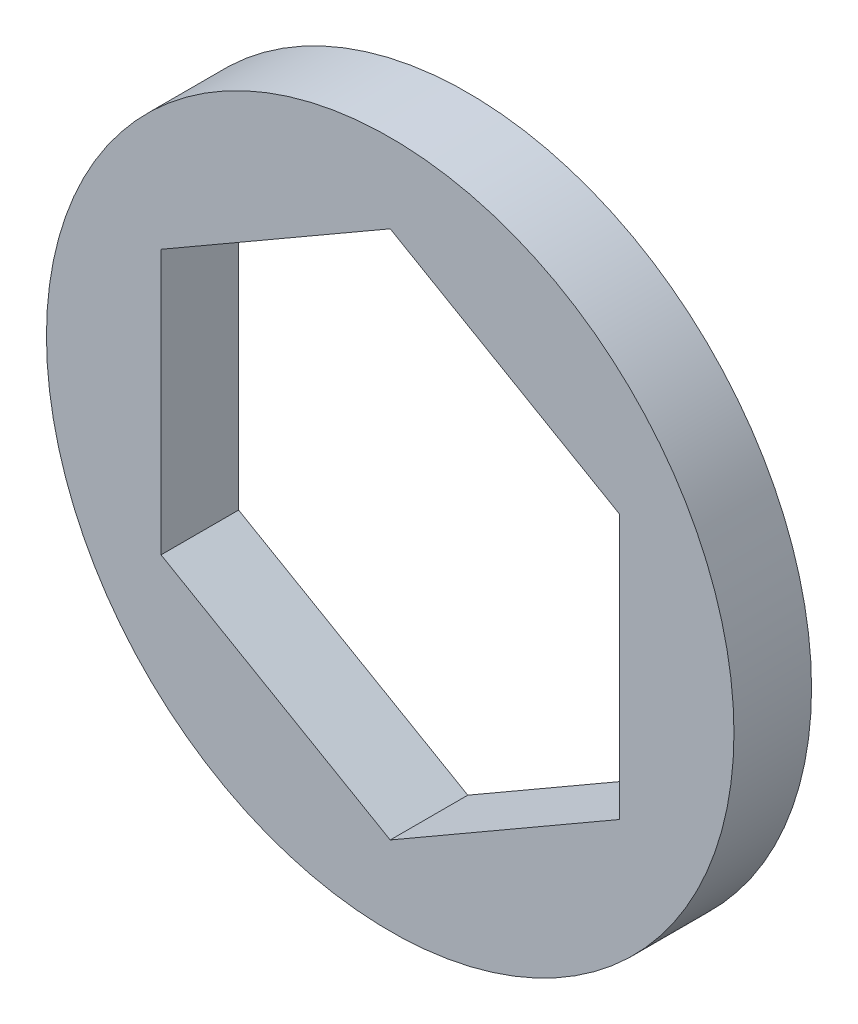
ISO-10303-21;
HEADER;
FILE_DESCRIPTION(('STEP AP214'),'2;1');
FILE_NAME('part.step','',(''),(''),'','','');
FILE_SCHEMA(('AUTOMOTIVE_DESIGN { 1 0 10303 214 1 1 1 1 }'));
ENDSEC;
DATA;
#1=APPLICATION_CONTEXT('core data for automotive mechanical design processes');
#2=APPLICATION_PROTOCOL_DEFINITION('international standard','automotive_design',2000,#1);
#3=PRODUCT_CONTEXT('',#1,'mechanical');
#4=PRODUCT('Part','Part','',(#3));
#5=PRODUCT_RELATED_PRODUCT_CATEGORY('part','',(#4));
#6=PRODUCT_DEFINITION_FORMATION('','',#4);
#7=PRODUCT_DEFINITION_CONTEXT('part definition',#1,'design');
#8=PRODUCT_DEFINITION('design','',#6,#7);
#9=PRODUCT_DEFINITION_SHAPE('','',#8);
#10=(LENGTH_UNIT() NAMED_UNIT(*) SI_UNIT(.MILLI.,.METRE.));
#11=(NAMED_UNIT(*) PLANE_ANGLE_UNIT() SI_UNIT($,.RADIAN.));
#12=(NAMED_UNIT(*) SI_UNIT($,.STERADIAN.) SOLID_ANGLE_UNIT());
#13=UNCERTAINTY_MEASURE_WITH_UNIT(LENGTH_MEASURE(1.E-05),#10,'distance_accuracy_value','');
#14=(GEOMETRIC_REPRESENTATION_CONTEXT(3) GLOBAL_UNCERTAINTY_ASSIGNED_CONTEXT((#13)) GLOBAL_UNIT_ASSIGNED_CONTEXT((#10,
#11,#12)) REPRESENTATION_CONTEXT('',''));
#15=CARTESIAN_POINT('',(0.,0.,0.));
#16=DIRECTION('',(0.,0.,1.));
#17=DIRECTION('',(1.,0.,0.));
#18=AXIS2_PLACEMENT_3D('',#15,#16,#17);
#19=CARTESIAN_POINT('',(0.,0.,1.074801));
#20=DIRECTION('',(0.,0.,1.));
#21=DIRECTION('',(1.,0.,0.));
#22=AXIS2_PLACEMENT_3D('',#19,#20,#21);
#23=PLANE('',#22);
#24=CARTESIAN_POINT('',(0.,0.,1.074801));
#25=DIRECTION('',(0.,0.,1.));
#26=DIRECTION('',(1.,0.,0.));
#27=AXIS2_PLACEMENT_3D('',#24,#25,#26);
#28=CIRCLE('',#27,9.525);
#29=CARTESIAN_POINT('',(9.525,0.,1.074801));
#30=VERTEX_POINT('',#29);
#31=EDGE_CURVE('E11',#30,#30,#28,.T.);
#32=ORIENTED_EDGE('',*,*,#31,.T.);
#33=EDGE_LOOP('',(#32));
#34=FACE_BOUND('',#33,.T.);
#35=DIRECTION('',(-0.866025403784439,-0.5,0.));
#36=VECTOR('',#35,1.);
#37=CARTESIAN_POINT('',(0.,7.33234841870825,1.074801));
#38=LINE('',#37,#36);
#39=CARTESIAN_POINT('',(0.,7.33234841870825,1.074801));
#40=VERTEX_POINT('',#39);
#41=CARTESIAN_POINT('',(-6.35,3.66617420935412,1.074801));
#42=VERTEX_POINT('',#41);
#43=EDGE_CURVE('E102',#40,#42,#38,.T.);
#44=ORIENTED_EDGE('',*,*,#43,.F.);
#45=DIRECTION('',(-0.866025403784439,0.5,0.));
#46=VECTOR('',#45,1.);
#47=CARTESIAN_POINT('',(6.35,3.66617420935412,1.074801));
#48=LINE('',#47,#46);
#49=CARTESIAN_POINT('',(6.35,3.66617420935412,1.074801));
#50=VERTEX_POINT('',#49);
#51=EDGE_CURVE('E94',#50,#40,#48,.T.);
#52=ORIENTED_EDGE('',*,*,#51,.F.);
#53=DIRECTION('',(0.,1.,0.));
#54=VECTOR('',#53,1.);
#55=CARTESIAN_POINT('',(6.35,-3.66617420935412,1.074801));
#56=LINE('',#55,#54);
#57=CARTESIAN_POINT('',(6.35,-3.66617420935412,1.074801));
#58=VERTEX_POINT('',#57);
#59=EDGE_CURVE('E122',#58,#50,#56,.T.);
#60=ORIENTED_EDGE('',*,*,#59,.F.);
#61=DIRECTION('',(0.866025403784439,0.5,0.));
#62=VECTOR('',#61,1.);
#63=CARTESIAN_POINT('',(0.,-7.33234841870825,1.074801));
#64=LINE('',#63,#62);
#65=CARTESIAN_POINT('',(0.,-7.33234841870825,1.074801));
#66=VERTEX_POINT('',#65);
#67=EDGE_CURVE('E120',#66,#58,#64,.T.);
#68=ORIENTED_EDGE('',*,*,#67,.F.);
#69=DIRECTION('',(0.866025403784438,-0.5,0.));
#70=VECTOR('',#69,1.);
#71=CARTESIAN_POINT('',(-6.35,-3.66617420935412,1.074801));
#72=LINE('',#71,#70);
#73=CARTESIAN_POINT('',(-6.35,-3.66617420935412,1.074801));
#74=VERTEX_POINT('',#73);
#75=EDGE_CURVE('E116',#74,#66,#72,.T.);
#76=ORIENTED_EDGE('',*,*,#75,.F.);
#77=DIRECTION('',(0.,-1.,0.));
#78=VECTOR('',#77,1.);
#79=CARTESIAN_POINT('',(-6.35,3.66617420935412,1.074801));
#80=LINE('',#79,#78);
#81=EDGE_CURVE('E114',#42,#74,#80,.T.);
#82=ORIENTED_EDGE('',*,*,#81,.F.);
#83=EDGE_LOOP('',(#44,#52,#60,#68,#76,#82));
#84=FACE_BOUND('',#83,.T.);
#85=ADVANCED_FACE('F41',(#34,#84),#23,.T.);
#86=CARTESIAN_POINT('',(0.,0.,-1.074801));
#87=DIRECTION('',(0.,0.,1.));
#88=DIRECTION('',(1.,0.,0.));
#89=AXIS2_PLACEMENT_3D('',#86,#87,#88);
#90=PLANE('',#89);
#91=CARTESIAN_POINT('',(0.,0.,-1.074801));
#92=DIRECTION('',(0.,0.,1.));
#93=DIRECTION('',(1.,0.,0.));
#94=AXIS2_PLACEMENT_3D('',#91,#92,#93);
#95=CIRCLE('',#94,9.525);
#96=CARTESIAN_POINT('',(9.525,0.,-1.074801));
#97=VERTEX_POINT('',#96);
#98=EDGE_CURVE('E45',#97,#97,#95,.T.);
#99=ORIENTED_EDGE('',*,*,#98,.F.);
#100=EDGE_LOOP('',(#99));
#101=FACE_BOUND('',#100,.T.);
#102=DIRECTION('',(-0.866025403784439,0.5,0.));
#103=VECTOR('',#102,1.);
#104=CARTESIAN_POINT('',(6.35,3.66617420935412,-1.074801));
#105=LINE('',#104,#103);
#106=CARTESIAN_POINT('',(6.35,3.66617420935412,-1.074801));
#107=VERTEX_POINT('',#106);
#108=CARTESIAN_POINT('',(0.,7.33234841870825,-1.074801));
#109=VERTEX_POINT('',#108);
#110=EDGE_CURVE('E64',#107,#109,#105,.T.);
#111=ORIENTED_EDGE('',*,*,#110,.T.);
#112=DIRECTION('',(-0.866025403784439,-0.5,0.));
#113=VECTOR('',#112,1.);
#114=CARTESIAN_POINT('',(0.,7.33234841870825,-1.074801));
#115=LINE('',#114,#113);
#116=CARTESIAN_POINT('',(-6.35,3.66617420935412,-1.074801));
#117=VERTEX_POINT('',#116);
#118=EDGE_CURVE('E109',#109,#117,#115,.T.);
#119=ORIENTED_EDGE('',*,*,#118,.T.);
#120=DIRECTION('',(0.,-1.,0.));
#121=VECTOR('',#120,1.);
#122=CARTESIAN_POINT('',(-6.35,3.66617420935412,-1.074801));
#123=LINE('',#122,#121);
#124=CARTESIAN_POINT('',(-6.35,-3.66617420935412,-1.074801));
#125=VERTEX_POINT('',#124);
#126=EDGE_CURVE('E126',#117,#125,#123,.T.);
#127=ORIENTED_EDGE('',*,*,#126,.T.);
#128=DIRECTION('',(0.866025403784438,-0.5,0.));
#129=VECTOR('',#128,1.);
#130=CARTESIAN_POINT('',(-6.35,-3.66617420935412,-1.074801));
#131=LINE('',#130,#129);
#132=CARTESIAN_POINT('',(0.,-7.33234841870825,-1.074801));
#133=VERTEX_POINT('',#132);
#134=EDGE_CURVE('E129',#125,#133,#131,.T.);
#135=ORIENTED_EDGE('',*,*,#134,.T.);
#136=DIRECTION('',(0.866025403784439,0.5,0.));
#137=VECTOR('',#136,1.);
#138=CARTESIAN_POINT('',(0.,-7.33234841870825,-1.074801));
#139=LINE('',#138,#137);
#140=CARTESIAN_POINT('',(6.35,-3.66617420935412,-1.074801));
#141=VERTEX_POINT('',#140);
#142=EDGE_CURVE('E132',#133,#141,#139,.T.);
#143=ORIENTED_EDGE('',*,*,#142,.T.);
#144=DIRECTION('',(0.,1.,0.));
#145=VECTOR('',#144,1.);
#146=CARTESIAN_POINT('',(6.35,-3.66617420935412,-1.074801));
#147=LINE('',#146,#145);
#148=EDGE_CURVE('E103',#141,#107,#147,.T.);
#149=ORIENTED_EDGE('',*,*,#148,.T.);
#150=EDGE_LOOP('',(#111,#119,#127,#135,#143,#149));
#151=FACE_BOUND('',#150,.T.);
#152=ADVANCED_FACE('F149',(#101,#151),#90,.F.);
#153=CARTESIAN_POINT('',(0.,0.,1.074801));
#154=DIRECTION('',(0.,0.,-1.));
#155=DIRECTION('',(-1.,0.,0.));
#156=AXIS2_PLACEMENT_3D('',#153,#154,#155);
#157=CYLINDRICAL_SURFACE('',#156,9.525);
#158=ORIENTED_EDGE('',*,*,#31,.F.);
#159=EDGE_LOOP('',(#158));
#160=FACE_BOUND('',#159,.T.);
#161=ORIENTED_EDGE('',*,*,#98,.T.);
#162=EDGE_LOOP('',(#161));
#163=FACE_BOUND('',#162,.T.);
#164=ADVANCED_FACE('F43',(#160,#163),#157,.T.);
#165=CARTESIAN_POINT('',(6.35,3.66617420935412,1.074801));
#166=DIRECTION('',(-0.5,-0.866025403784439,0.));
#167=DIRECTION('',(0.866025403784439,-0.5,0.));
#168=AXIS2_PLACEMENT_3D('',#165,#166,#167);
#169=PLANE('',#168);
#170=ORIENTED_EDGE('',*,*,#110,.F.);
#171=DIRECTION('',(0.,0.,-1.));
#172=VECTOR('',#171,1.);
#173=CARTESIAN_POINT('',(6.35,3.66617420935412,1.074801));
#174=LINE('',#173,#172);
#175=EDGE_CURVE('E98',#50,#107,#174,.T.);
#176=ORIENTED_EDGE('',*,*,#175,.F.);
#177=ORIENTED_EDGE('',*,*,#51,.T.);
#178=DIRECTION('',(0.,0.,-1.));
#179=VECTOR('',#178,1.);
#180=CARTESIAN_POINT('',(0.,7.33234841870825,1.074801));
#181=LINE('',#180,#179);
#182=EDGE_CURVE('E97',#40,#109,#181,.T.);
#183=ORIENTED_EDGE('',*,*,#182,.T.);
#184=EDGE_LOOP('',(#170,#176,#177,#183));
#185=FACE_BOUND('',#184,.T.);
#186=ADVANCED_FACE('F96',(#185),#169,.T.);
#187=CARTESIAN_POINT('',(0.,7.33234841870825,1.074801));
#188=DIRECTION('',(0.5,-0.866025403784439,0.));
#189=DIRECTION('',(0.866025403784439,0.5,0.));
#190=AXIS2_PLACEMENT_3D('',#187,#188,#189);
#191=PLANE('',#190);
#192=ORIENTED_EDGE('',*,*,#118,.F.);
#193=ORIENTED_EDGE('',*,*,#182,.F.);
#194=ORIENTED_EDGE('',*,*,#43,.T.);
#195=DIRECTION('',(0.,0.,-1.));
#196=VECTOR('',#195,1.);
#197=CARTESIAN_POINT('',(-6.35,3.66617420935412,1.074801));
#198=LINE('',#197,#196);
#199=EDGE_CURVE('E110',#42,#117,#198,.T.);
#200=ORIENTED_EDGE('',*,*,#199,.T.);
#201=EDGE_LOOP('',(#192,#193,#194,#200));
#202=FACE_BOUND('',#201,.T.);
#203=ADVANCED_FACE('F106',(#202),#191,.T.);
#204=CARTESIAN_POINT('',(-6.35,3.66617420935412,1.074801));
#205=DIRECTION('',(1.,0.,0.));
#206=DIRECTION('',(0.,1.,0.));
#207=AXIS2_PLACEMENT_3D('',#204,#205,#206);
#208=PLANE('',#207);
#209=ORIENTED_EDGE('',*,*,#126,.F.);
#210=ORIENTED_EDGE('',*,*,#199,.F.);
#211=ORIENTED_EDGE('',*,*,#81,.T.);
#212=DIRECTION('',(0.,0.,-1.));
#213=VECTOR('',#212,1.);
#214=CARTESIAN_POINT('',(-6.35,-3.66617420935412,1.074801));
#215=LINE('',#214,#213);
#216=EDGE_CURVE('E141',#74,#125,#215,.T.);
#217=ORIENTED_EDGE('',*,*,#216,.T.);
#218=EDGE_LOOP('',(#209,#210,#211,#217));
#219=FACE_BOUND('',#218,.T.);
#220=ADVANCED_FACE('F145',(#219),#208,.T.);
#221=CARTESIAN_POINT('',(-6.35,-3.66617420935412,1.074801));
#222=DIRECTION('',(0.5,0.866025403784438,0.));
#223=DIRECTION('',(-0.866025403784439,0.5,0.));
#224=AXIS2_PLACEMENT_3D('',#221,#222,#223);
#225=PLANE('',#224);
#226=ORIENTED_EDGE('',*,*,#134,.F.);
#227=ORIENTED_EDGE('',*,*,#216,.F.);
#228=ORIENTED_EDGE('',*,*,#75,.T.);
#229=DIRECTION('',(0.,0.,-1.));
#230=VECTOR('',#229,1.);
#231=CARTESIAN_POINT('',(0.,-7.33234841870825,1.074801));
#232=LINE('',#231,#230);
#233=EDGE_CURVE('E139',#66,#133,#232,.T.);
#234=ORIENTED_EDGE('',*,*,#233,.T.);
#235=EDGE_LOOP('',(#226,#227,#228,#234));
#236=FACE_BOUND('',#235,.T.);
#237=ADVANCED_FACE('F157',(#236),#225,.T.);
#238=CARTESIAN_POINT('',(0.,-7.33234841870825,1.074801));
#239=DIRECTION('',(-0.5,0.866025403784439,0.));
#240=DIRECTION('',(-0.866025403784439,-0.5,0.));
#241=AXIS2_PLACEMENT_3D('',#238,#239,#240);
#242=PLANE('',#241);
#243=ORIENTED_EDGE('',*,*,#142,.F.);
#244=ORIENTED_EDGE('',*,*,#233,.F.);
#245=ORIENTED_EDGE('',*,*,#67,.T.);
#246=DIRECTION('',(0.,0.,-1.));
#247=VECTOR('',#246,1.);
#248=CARTESIAN_POINT('',(6.35,-3.66617420935412,1.074801));
#249=LINE('',#248,#247);
#250=EDGE_CURVE('E56',#58,#141,#249,.T.);
#251=ORIENTED_EDGE('',*,*,#250,.T.);
#252=EDGE_LOOP('',(#243,#244,#245,#251));
#253=FACE_BOUND('',#252,.T.);
#254=ADVANCED_FACE('F155',(#253),#242,.T.);
#255=CARTESIAN_POINT('',(6.35,-3.66617420935412,1.074801));
#256=DIRECTION('',(-1.,0.,0.));
#257=DIRECTION('',(0.,-1.,0.));
#258=AXIS2_PLACEMENT_3D('',#255,#256,#257);
#259=PLANE('',#258);
#260=ORIENTED_EDGE('',*,*,#148,.F.);
#261=ORIENTED_EDGE('',*,*,#250,.F.);
#262=ORIENTED_EDGE('',*,*,#59,.T.);
#263=ORIENTED_EDGE('',*,*,#175,.T.);
#264=EDGE_LOOP('',(#260,#261,#262,#263));
#265=FACE_BOUND('',#264,.T.);
#266=ADVANCED_FACE('F151',(#265),#259,.T.);
#267=CLOSED_SHELL('',(#85,#152,#164,#186,#203,#220,#237,#254,#266));
#268=MANIFOLD_SOLID_BREP('B2',#267);
#269=ADVANCED_BREP_SHAPE_REPRESENTATION('',(#18,#268),#14);
#270=SHAPE_DEFINITION_REPRESENTATION(#9,#269);
ENDSEC;
END-ISO-10303-21;
